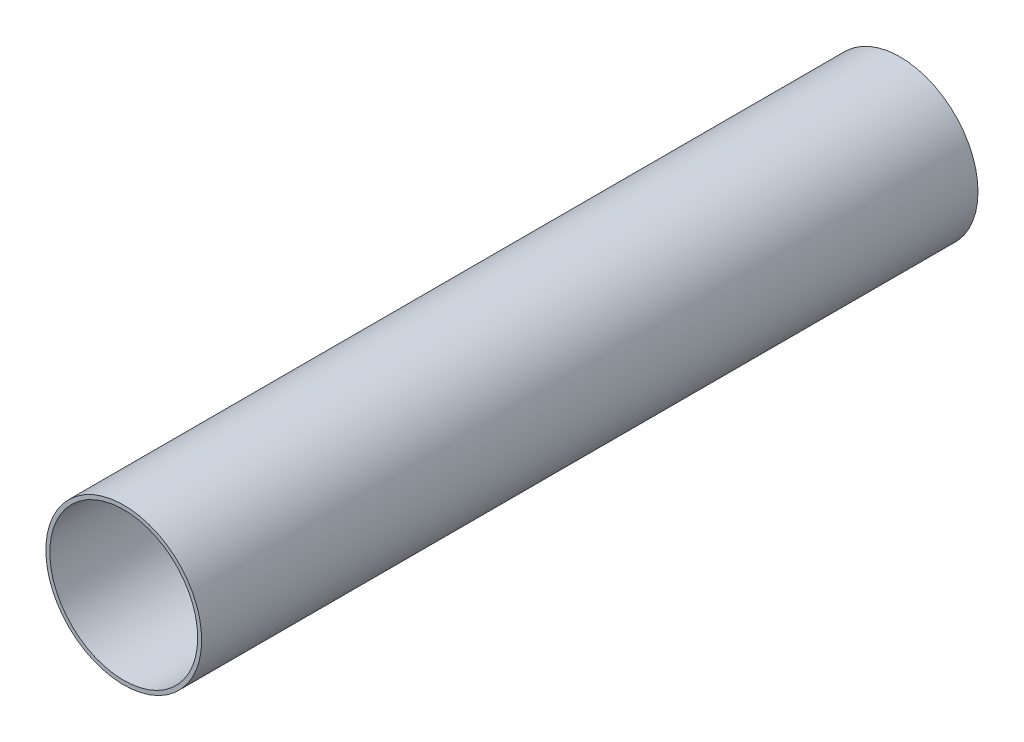
ISO-10303-21;
HEADER;
FILE_DESCRIPTION(('STEP AP214'),'2;1');
FILE_NAME('part.step','',(''),(''),'','','');
FILE_SCHEMA(('AUTOMOTIVE_DESIGN { 1 0 10303 214 1 1 1 1 }'));
ENDSEC;
DATA;
#1=APPLICATION_CONTEXT('core data for automotive mechanical design processes');
#2=APPLICATION_PROTOCOL_DEFINITION('international standard','automotive_design',2000,#1);
#3=PRODUCT_CONTEXT('',#1,'mechanical');
#4=PRODUCT('Part','Part','',(#3));
#5=PRODUCT_RELATED_PRODUCT_CATEGORY('part','',(#4));
#6=PRODUCT_DEFINITION_FORMATION('','',#4);
#7=PRODUCT_DEFINITION_CONTEXT('part definition',#1,'design');
#8=PRODUCT_DEFINITION('design','',#6,#7);
#9=PRODUCT_DEFINITION_SHAPE('','',#8);
#10=(LENGTH_UNIT() NAMED_UNIT(*) SI_UNIT(.MILLI.,.METRE.));
#11=(NAMED_UNIT(*) PLANE_ANGLE_UNIT() SI_UNIT($,.RADIAN.));
#12=(NAMED_UNIT(*) SI_UNIT($,.STERADIAN.) SOLID_ANGLE_UNIT());
#13=UNCERTAINTY_MEASURE_WITH_UNIT(LENGTH_MEASURE(1.E-05),#10,'distance_accuracy_value','');
#14=(GEOMETRIC_REPRESENTATION_CONTEXT(3) GLOBAL_UNCERTAINTY_ASSIGNED_CONTEXT((#13)) GLOBAL_UNIT_ASSIGNED_CONTEXT((#10,
#11,#12)) REPRESENTATION_CONTEXT('',''));
#15=CARTESIAN_POINT('',(0.,0.,0.));
#16=DIRECTION('',(0.,0.,1.));
#17=DIRECTION('',(1.,0.,0.));
#18=AXIS2_PLACEMENT_3D('',#15,#16,#17);
#19=CARTESIAN_POINT('',(0.,0.,533.4));
#20=DIRECTION('',(0.,0.,1.));
#21=DIRECTION('',(1.,0.,0.));
#22=AXIS2_PLACEMENT_3D('',#19,#20,#21);
#23=PLANE('',#22);
#24=CARTESIAN_POINT('',(0.,0.,533.4));
#25=DIRECTION('',(0.,0.,1.));
#26=DIRECTION('',(1.,0.,0.));
#27=AXIS2_PLACEMENT_3D('',#24,#25,#26);
#28=CIRCLE('',#27,53.5305);
#29=CARTESIAN_POINT('',(53.5305,0.,533.4));
#30=VERTEX_POINT('',#29);
#31=EDGE_CURVE('E10',#30,#30,#28,.T.);
#32=ORIENTED_EDGE('',*,*,#31,.T.);
#33=EDGE_LOOP('',(#32));
#34=FACE_BOUND('',#33,.T.);
#35=CARTESIAN_POINT('',(0.,0.,533.4));
#36=DIRECTION('',(0.,0.,1.));
#37=DIRECTION('',(1.,0.,0.));
#38=AXIS2_PLACEMENT_3D('',#35,#36,#37);
#39=CIRCLE('',#38,50.8);
#40=CARTESIAN_POINT('',(50.8,0.,533.4));
#41=VERTEX_POINT('',#40);
#42=EDGE_CURVE('E43',#41,#41,#39,.T.);
#43=ORIENTED_EDGE('',*,*,#42,.F.);
#44=EDGE_LOOP('',(#43));
#45=FACE_BOUND('',#44,.T.);
#46=ADVANCED_FACE('F32',(#34,#45),#23,.T.);
#47=CARTESIAN_POINT('',(0.,0.,0.));
#48=DIRECTION('',(0.,0.,1.));
#49=DIRECTION('',(1.,0.,0.));
#50=AXIS2_PLACEMENT_3D('',#47,#48,#49);
#51=PLANE('',#50);
#52=CARTESIAN_POINT('',(0.,0.,0.));
#53=DIRECTION('',(0.,0.,1.));
#54=DIRECTION('',(1.,0.,0.));
#55=AXIS2_PLACEMENT_3D('',#52,#53,#54);
#56=CIRCLE('',#55,53.5305);
#57=CARTESIAN_POINT('',(53.5305,0.,0.));
#58=VERTEX_POINT('',#57);
#59=EDGE_CURVE('E36',#58,#58,#56,.T.);
#60=ORIENTED_EDGE('',*,*,#59,.F.);
#61=EDGE_LOOP('',(#60));
#62=FACE_BOUND('',#61,.T.);
#63=CARTESIAN_POINT('',(0.,0.,0.));
#64=DIRECTION('',(0.,0.,1.));
#65=DIRECTION('',(1.,0.,0.));
#66=AXIS2_PLACEMENT_3D('',#63,#64,#65);
#67=CIRCLE('',#66,50.8);
#68=CARTESIAN_POINT('',(50.8,0.,0.));
#69=VERTEX_POINT('',#68);
#70=EDGE_CURVE('E45',#69,#69,#67,.T.);
#71=ORIENTED_EDGE('',*,*,#70,.T.);
#72=EDGE_LOOP('',(#71));
#73=FACE_BOUND('',#72,.T.);
#74=ADVANCED_FACE('F55',(#62,#73),#51,.F.);
#75=CARTESIAN_POINT('',(0.,0.,533.4));
#76=DIRECTION('',(0.,0.,-1.));
#77=DIRECTION('',(-1.,0.,0.));
#78=AXIS2_PLACEMENT_3D('',#75,#76,#77);
#79=CYLINDRICAL_SURFACE('',#78,53.5305);
#80=ORIENTED_EDGE('',*,*,#31,.F.);
#81=EDGE_LOOP('',(#80));
#82=FACE_BOUND('',#81,.T.);
#83=ORIENTED_EDGE('',*,*,#59,.T.);
#84=EDGE_LOOP('',(#83));
#85=FACE_BOUND('',#84,.T.);
#86=ADVANCED_FACE('F34',(#82,#85),#79,.T.);
#87=CARTESIAN_POINT('',(0.,0.,533.4));
#88=DIRECTION('',(0.,0.,-1.));
#89=DIRECTION('',(-1.,0.,0.));
#90=AXIS2_PLACEMENT_3D('',#87,#88,#89);
#91=CYLINDRICAL_SURFACE('',#90,50.8);
#92=ORIENTED_EDGE('',*,*,#42,.T.);
#93=EDGE_LOOP('',(#92));
#94=FACE_BOUND('',#93,.T.);
#95=ORIENTED_EDGE('',*,*,#70,.F.);
#96=EDGE_LOOP('',(#95));
#97=FACE_BOUND('',#96,.T.);
#98=ADVANCED_FACE('F51',(#94,#97),#91,.F.);
#99=CLOSED_SHELL('',(#46,#74,#86,#98));
#100=MANIFOLD_SOLID_BREP('B2',#99);
#101=ADVANCED_BREP_SHAPE_REPRESENTATION('',(#18,#100),#14);
#102=SHAPE_DEFINITION_REPRESENTATION(#9,#101);
ENDSEC;
END-ISO-10303-21;
